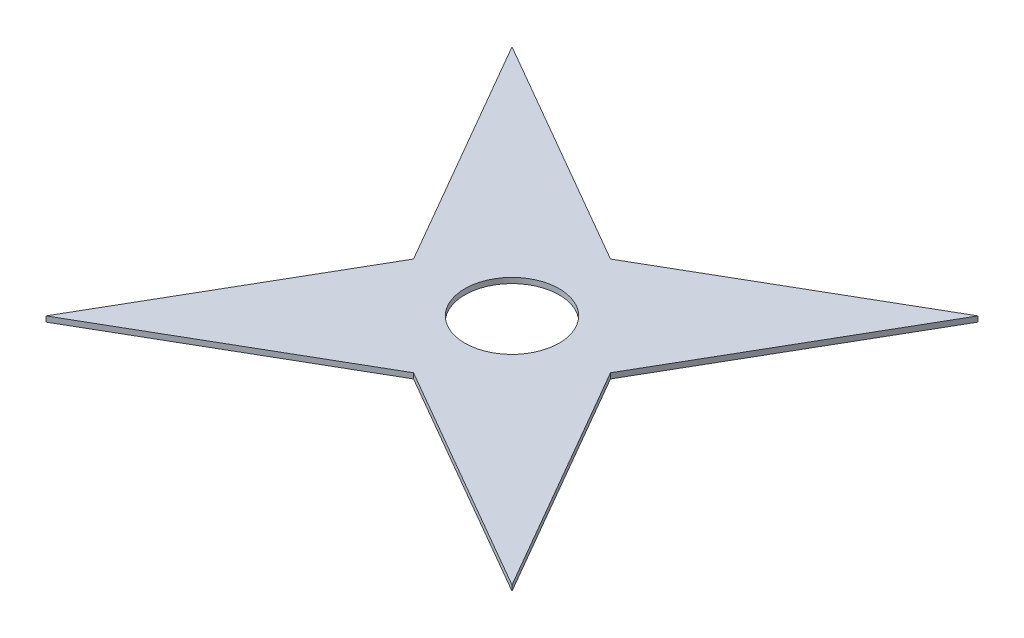
ISO-10303-21;
HEADER;
FILE_DESCRIPTION(('STEP AP214'),'2;1');
FILE_NAME('part.step','',(''),(''),'','','');
FILE_SCHEMA(('AUTOMOTIVE_DESIGN { 1 0 10303 214 1 1 1 1 }'));
ENDSEC;
DATA;
#1=APPLICATION_CONTEXT('core data for automotive mechanical design processes');
#2=APPLICATION_PROTOCOL_DEFINITION('international standard','automotive_design',2000,#1);
#3=PRODUCT_CONTEXT('',#1,'mechanical');
#4=PRODUCT('Part','Part','',(#3));
#5=PRODUCT_RELATED_PRODUCT_CATEGORY('part','',(#4));
#6=PRODUCT_DEFINITION_FORMATION('','',#4);
#7=PRODUCT_DEFINITION_CONTEXT('part definition',#1,'design');
#8=PRODUCT_DEFINITION('design','',#6,#7);
#9=PRODUCT_DEFINITION_SHAPE('','',#8);
#10=(LENGTH_UNIT() NAMED_UNIT(*) SI_UNIT(.MILLI.,.METRE.));
#11=(NAMED_UNIT(*) PLANE_ANGLE_UNIT() SI_UNIT($,.RADIAN.));
#12=(NAMED_UNIT(*) SI_UNIT($,.STERADIAN.) SOLID_ANGLE_UNIT());
#13=UNCERTAINTY_MEASURE_WITH_UNIT(LENGTH_MEASURE(1.E-05),#10,'distance_accuracy_value','');
#14=(GEOMETRIC_REPRESENTATION_CONTEXT(3) GLOBAL_UNCERTAINTY_ASSIGNED_CONTEXT((#13)) GLOBAL_UNIT_ASSIGNED_CONTEXT((#10,
#11,#12)) REPRESENTATION_CONTEXT('',''));
#15=CARTESIAN_POINT('',(0.,0.,0.));
#16=DIRECTION('',(0.,0.,1.));
#17=DIRECTION('',(1.,0.,0.));
#18=AXIS2_PLACEMENT_3D('',#15,#16,#17);
#19=CARTESIAN_POINT('',(0.,1.5,0.));
#20=DIRECTION('',(0.,1.,0.));
#21=DIRECTION('',(0.,0.,1.));
#22=AXIS2_PLACEMENT_3D('',#19,#20,#21);
#23=PLANE('',#22);
#24=DIRECTION('',(0.866025403784438,0.,-0.500000000000001));
#25=VECTOR('',#24,1.);
#26=CARTESIAN_POINT('',(0.,1.5,0.));
#27=LINE('',#26,#25);
#28=CARTESIAN_POINT('',(0.,1.5,0.));
#29=VERTEX_POINT('',#28);
#30=CARTESIAN_POINT('',(64.9519052838328,1.5,-37.5000000000001));
#31=VERTEX_POINT('',#30);
#32=EDGE_CURVE('E149',#29,#31,#27,.T.);
#33=ORIENTED_EDGE('',*,*,#32,.T.);
#34=DIRECTION('',(0.866025403784438,0.,0.500000000000001));
#35=VECTOR('',#34,1.);
#36=CARTESIAN_POINT('',(129.903810567666,1.5,0.));
#37=LINE('',#36,#35);
#38=CARTESIAN_POINT('',(129.903810567666,1.5,0.));
#39=VERTEX_POINT('',#38);
#40=EDGE_CURVE('E97',#31,#39,#37,.T.);
#41=ORIENTED_EDGE('',*,*,#40,.T.);
#42=DIRECTION('',(-0.500000000000001,0.,-0.866025403784438));
#43=VECTOR('',#42,1.);
#44=CARTESIAN_POINT('',(129.903810567666,1.5,0.));
#45=LINE('',#44,#43);
#46=CARTESIAN_POINT('',(92.4038105676656,1.5,-64.9519052838328));
#47=VERTEX_POINT('',#46);
#48=EDGE_CURVE('E164',#39,#47,#45,.T.);
#49=ORIENTED_EDGE('',*,*,#48,.T.);
#50=DIRECTION('',(0.5,0.,-0.866025403784438));
#51=VECTOR('',#50,1.);
#52=CARTESIAN_POINT('',(129.903810567666,1.5,-129.903810567666));
#53=LINE('',#52,#51);
#54=CARTESIAN_POINT('',(129.903810567666,1.5,-129.903810567666));
#55=VERTEX_POINT('',#54);
#56=EDGE_CURVE('E177',#47,#55,#53,.T.);
#57=ORIENTED_EDGE('',*,*,#56,.T.);
#58=DIRECTION('',(-0.866025403784438,0.,0.500000000000001));
#59=VECTOR('',#58,1.);
#60=CARTESIAN_POINT('',(129.903810567666,1.5,-129.903810567666));
#61=LINE('',#60,#59);
#62=CARTESIAN_POINT('',(64.9519052838328,1.5,-92.4038105676656));
#63=VERTEX_POINT('',#62);
#64=EDGE_CURVE('E116',#55,#63,#61,.T.);
#65=ORIENTED_EDGE('',*,*,#64,.T.);
#66=DIRECTION('',(-0.866025403784438,0.,-0.500000000000001));
#67=VECTOR('',#66,1.);
#68=CARTESIAN_POINT('',(0.,1.5,-129.903810567666));
#69=LINE('',#68,#67);
#70=CARTESIAN_POINT('',(0.,1.5,-129.903810567666));
#71=VERTEX_POINT('',#70);
#72=EDGE_CURVE('E110',#63,#71,#69,.T.);
#73=ORIENTED_EDGE('',*,*,#72,.T.);
#74=DIRECTION('',(0.500000000000001,0.,0.866025403784438));
#75=VECTOR('',#74,1.);
#76=CARTESIAN_POINT('',(0.,1.5,-129.903810567666));
#77=LINE('',#76,#75);
#78=CARTESIAN_POINT('',(37.5000000000001,1.5,-64.9519052838328));
#79=VERTEX_POINT('',#78);
#80=EDGE_CURVE('E114',#71,#79,#77,.T.);
#81=ORIENTED_EDGE('',*,*,#80,.T.);
#82=DIRECTION('',(-0.500000000000001,0.,0.866025403784438));
#83=VECTOR('',#82,1.);
#84=CARTESIAN_POINT('',(0.,1.5,0.));
#85=LINE('',#84,#83);
#86=EDGE_CURVE('E54',#79,#29,#85,.T.);
#87=ORIENTED_EDGE('',*,*,#86,.T.);
#88=EDGE_LOOP('',(#33,#41,#49,#57,#65,#73,#81,#87));
#89=FACE_BOUND('',#88,.T.);
#90=CARTESIAN_POINT('',(64.9519052838328,1.5,-64.9519052838328));
#91=DIRECTION('',(0.,1.,0.));
#92=DIRECTION('',(0.,0.,1.));
#93=AXIS2_PLACEMENT_3D('',#90,#91,#92);
#94=CIRCLE('',#93,13.155);
#95=CARTESIAN_POINT('',(64.9519052838328,1.5,-51.7969052838328));
#96=VERTEX_POINT('',#95);
#97=EDGE_CURVE('E138',#96,#96,#94,.T.);
#98=ORIENTED_EDGE('',*,*,#97,.F.);
#99=EDGE_LOOP('',(#98));
#100=FACE_BOUND('',#99,.T.);
#101=ADVANCED_FACE('F37',(#89,#100),#23,.T.);
#102=CARTESIAN_POINT('',(0.,0.,0.));
#103=DIRECTION('',(0.,1.,0.));
#104=DIRECTION('',(0.,0.,1.));
#105=AXIS2_PLACEMENT_3D('',#102,#103,#104);
#106=PLANE('',#105);
#107=DIRECTION('',(0.866025403784438,0.,-0.500000000000001));
#108=VECTOR('',#107,1.);
#109=CARTESIAN_POINT('',(0.,0.,0.));
#110=LINE('',#109,#108);
#111=CARTESIAN_POINT('',(0.,0.,0.));
#112=VERTEX_POINT('',#111);
#113=CARTESIAN_POINT('',(64.9519052838328,0.,-37.5000000000001));
#114=VERTEX_POINT('',#113);
#115=EDGE_CURVE('E134',#112,#114,#110,.T.);
#116=ORIENTED_EDGE('',*,*,#115,.F.);
#117=DIRECTION('',(-0.500000000000001,0.,0.866025403784438));
#118=VECTOR('',#117,1.);
#119=CARTESIAN_POINT('',(0.,0.,0.));
#120=LINE('',#119,#118);
#121=CARTESIAN_POINT('',(37.5000000000001,0.,-64.9519052838328));
#122=VERTEX_POINT('',#121);
#123=EDGE_CURVE('E89',#122,#112,#120,.T.);
#124=ORIENTED_EDGE('',*,*,#123,.F.);
#125=DIRECTION('',(0.500000000000001,0.,0.866025403784438));
#126=VECTOR('',#125,1.);
#127=CARTESIAN_POINT('',(0.,0.,-129.903810567666));
#128=LINE('',#127,#126);
#129=CARTESIAN_POINT('',(0.,0.,-129.903810567666));
#130=VERTEX_POINT('',#129);
#131=EDGE_CURVE('E83',#130,#122,#128,.T.);
#132=ORIENTED_EDGE('',*,*,#131,.F.);
#133=DIRECTION('',(-0.866025403784438,0.,-0.500000000000001));
#134=VECTOR('',#133,1.);
#135=CARTESIAN_POINT('',(0.,0.,-129.903810567666));
#136=LINE('',#135,#134);
#137=CARTESIAN_POINT('',(64.9519052838328,0.,-92.4038105676656));
#138=VERTEX_POINT('',#137);
#139=EDGE_CURVE('E124',#138,#130,#136,.T.);
#140=ORIENTED_EDGE('',*,*,#139,.F.);
#141=DIRECTION('',(-0.866025403784438,0.,0.500000000000001));
#142=VECTOR('',#141,1.);
#143=CARTESIAN_POINT('',(129.903810567666,0.,-129.903810567666));
#144=LINE('',#143,#142);
#145=CARTESIAN_POINT('',(129.903810567666,0.,-129.903810567666));
#146=VERTEX_POINT('',#145);
#147=EDGE_CURVE('E144',#146,#138,#144,.T.);
#148=ORIENTED_EDGE('',*,*,#147,.F.);
#149=DIRECTION('',(0.5,0.,-0.866025403784438));
#150=VECTOR('',#149,1.);
#151=CARTESIAN_POINT('',(129.903810567666,0.,-129.903810567666));
#152=LINE('',#151,#150);
#153=CARTESIAN_POINT('',(92.4038105676656,0.,-64.9519052838328));
#154=VERTEX_POINT('',#153);
#155=EDGE_CURVE('E142',#154,#146,#152,.T.);
#156=ORIENTED_EDGE('',*,*,#155,.F.);
#157=DIRECTION('',(-0.500000000000001,0.,-0.866025403784438));
#158=VECTOR('',#157,1.);
#159=CARTESIAN_POINT('',(129.903810567666,0.,0.));
#160=LINE('',#159,#158);
#161=CARTESIAN_POINT('',(129.903810567666,0.,0.));
#162=VERTEX_POINT('',#161);
#163=EDGE_CURVE('E140',#162,#154,#160,.T.);
#164=ORIENTED_EDGE('',*,*,#163,.F.);
#165=DIRECTION('',(0.866025403784438,0.,0.500000000000001));
#166=VECTOR('',#165,1.);
#167=CARTESIAN_POINT('',(129.903810567666,0.,0.));
#168=LINE('',#167,#166);
#169=EDGE_CURVE('E137',#114,#162,#168,.T.);
#170=ORIENTED_EDGE('',*,*,#169,.F.);
#171=EDGE_LOOP('',(#116,#124,#132,#140,#148,#156,#164,#170));
#172=FACE_BOUND('',#171,.T.);
#173=CARTESIAN_POINT('',(64.9519052838328,0.,-64.9519052838328));
#174=DIRECTION('',(0.,1.,0.));
#175=DIRECTION('',(0.,0.,1.));
#176=AXIS2_PLACEMENT_3D('',#173,#174,#175);
#177=CIRCLE('',#176,13.155);
#178=CARTESIAN_POINT('',(64.9519052838328,0.,-51.7969052838328));
#179=VERTEX_POINT('',#178);
#180=EDGE_CURVE('E183',#179,#179,#177,.T.);
#181=ORIENTED_EDGE('',*,*,#180,.T.);
#182=EDGE_LOOP('',(#181));
#183=FACE_BOUND('',#182,.T.);
#184=ADVANCED_FACE('F168',(#172,#183),#106,.F.);
#185=CARTESIAN_POINT('',(0.,1.5,0.));
#186=DIRECTION('',(-0.500000000000001,0.,-0.866025403784438));
#187=DIRECTION('',(-0.866025403784438,0.,0.500000000000001));
#188=AXIS2_PLACEMENT_3D('',#185,#186,#187);
#189=PLANE('',#188);
#190=ORIENTED_EDGE('',*,*,#115,.T.);
#191=DIRECTION('',(0.,-1.,0.));
#192=VECTOR('',#191,1.);
#193=CARTESIAN_POINT('',(64.9519052838328,1.5,-37.5000000000001));
#194=LINE('',#193,#192);
#195=EDGE_CURVE('E11',#31,#114,#194,.T.);
#196=ORIENTED_EDGE('',*,*,#195,.F.);
#197=ORIENTED_EDGE('',*,*,#32,.F.);
#198=DIRECTION('',(0.,-1.,0.));
#199=VECTOR('',#198,1.);
#200=CARTESIAN_POINT('',(0.,1.5,0.));
#201=LINE('',#200,#199);
#202=EDGE_CURVE('E130',#29,#112,#201,.T.);
#203=ORIENTED_EDGE('',*,*,#202,.T.);
#204=EDGE_LOOP('',(#190,#196,#197,#203));
#205=FACE_BOUND('',#204,.T.);
#206=ADVANCED_FACE('F39',(#205),#189,.F.);
#207=CARTESIAN_POINT('',(129.903810567666,1.5,0.));
#208=DIRECTION('',(0.500000000000001,0.,-0.866025403784438));
#209=DIRECTION('',(-0.866025403784438,0.,-0.500000000000001));
#210=AXIS2_PLACEMENT_3D('',#207,#208,#209);
#211=PLANE('',#210);
#212=ORIENTED_EDGE('',*,*,#169,.T.);
#213=DIRECTION('',(0.,-1.,0.));
#214=VECTOR('',#213,1.);
#215=CARTESIAN_POINT('',(129.903810567666,1.5,0.));
#216=LINE('',#215,#214);
#217=EDGE_CURVE('E46',#39,#162,#216,.T.);
#218=ORIENTED_EDGE('',*,*,#217,.F.);
#219=ORIENTED_EDGE('',*,*,#40,.F.);
#220=ORIENTED_EDGE('',*,*,#195,.T.);
#221=EDGE_LOOP('',(#212,#218,#219,#220));
#222=FACE_BOUND('',#221,.T.);
#223=ADVANCED_FACE('F211',(#222),#211,.F.);
#224=CARTESIAN_POINT('',(129.903810567666,1.5,0.));
#225=DIRECTION('',(-0.866025403784438,0.,0.500000000000001));
#226=DIRECTION('',(0.500000000000001,0.,0.866025403784438));
#227=AXIS2_PLACEMENT_3D('',#224,#225,#226);
#228=PLANE('',#227);
#229=ORIENTED_EDGE('',*,*,#163,.T.);
#230=DIRECTION('',(0.,-1.,0.));
#231=VECTOR('',#230,1.);
#232=CARTESIAN_POINT('',(92.4038105676656,1.5,-64.9519052838328));
#233=LINE('',#232,#231);
#234=EDGE_CURVE('E156',#47,#154,#233,.T.);
#235=ORIENTED_EDGE('',*,*,#234,.F.);
#236=ORIENTED_EDGE('',*,*,#48,.F.);
#237=ORIENTED_EDGE('',*,*,#217,.T.);
#238=EDGE_LOOP('',(#229,#235,#236,#237));
#239=FACE_BOUND('',#238,.T.);
#240=ADVANCED_FACE('F162',(#239),#228,.F.);
#241=CARTESIAN_POINT('',(129.903810567666,1.5,-129.903810567666));
#242=DIRECTION('',(-0.866025403784438,0.,-0.500000000000001));
#243=DIRECTION('',(-0.500000000000001,0.,0.866025403784438));
#244=AXIS2_PLACEMENT_3D('',#241,#242,#243);
#245=PLANE('',#244);
#246=ORIENTED_EDGE('',*,*,#155,.T.);
#247=DIRECTION('',(0.,-1.,0.));
#248=VECTOR('',#247,1.);
#249=CARTESIAN_POINT('',(129.903810567666,1.5,-129.903810567666));
#250=LINE('',#249,#248);
#251=EDGE_CURVE('E153',#55,#146,#250,.T.);
#252=ORIENTED_EDGE('',*,*,#251,.F.);
#253=ORIENTED_EDGE('',*,*,#56,.F.);
#254=ORIENTED_EDGE('',*,*,#234,.T.);
#255=EDGE_LOOP('',(#246,#252,#253,#254));
#256=FACE_BOUND('',#255,.T.);
#257=ADVANCED_FACE('F173',(#256),#245,.F.);
#258=CARTESIAN_POINT('',(129.903810567666,1.5,-129.903810567666));
#259=DIRECTION('',(0.500000000000001,0.,0.866025403784438));
#260=DIRECTION('',(0.866025403784438,0.,-0.500000000000001));
#261=AXIS2_PLACEMENT_3D('',#258,#259,#260);
#262=PLANE('',#261);
#263=ORIENTED_EDGE('',*,*,#147,.T.);
#264=DIRECTION('',(0.,-1.,0.));
#265=VECTOR('',#264,1.);
#266=CARTESIAN_POINT('',(64.9519052838328,1.5,-92.4038105676656));
#267=LINE('',#266,#265);
#268=EDGE_CURVE('E125',#63,#138,#267,.T.);
#269=ORIENTED_EDGE('',*,*,#268,.F.);
#270=ORIENTED_EDGE('',*,*,#64,.F.);
#271=ORIENTED_EDGE('',*,*,#251,.T.);
#272=EDGE_LOOP('',(#263,#269,#270,#271));
#273=FACE_BOUND('',#272,.T.);
#274=ADVANCED_FACE('F176',(#273),#262,.F.);
#275=CARTESIAN_POINT('',(0.,1.5,-129.903810567666));
#276=DIRECTION('',(-0.500000000000001,0.,0.866025403784438));
#277=DIRECTION('',(0.866025403784438,0.,0.500000000000001));
#278=AXIS2_PLACEMENT_3D('',#275,#276,#277);
#279=PLANE('',#278);
#280=ORIENTED_EDGE('',*,*,#139,.T.);
#281=DIRECTION('',(0.,-1.,0.));
#282=VECTOR('',#281,1.);
#283=CARTESIAN_POINT('',(0.,1.5,-129.903810567666));
#284=LINE('',#283,#282);
#285=EDGE_CURVE('E121',#71,#130,#284,.T.);
#286=ORIENTED_EDGE('',*,*,#285,.F.);
#287=ORIENTED_EDGE('',*,*,#72,.F.);
#288=ORIENTED_EDGE('',*,*,#268,.T.);
#289=EDGE_LOOP('',(#280,#286,#287,#288));
#290=FACE_BOUND('',#289,.T.);
#291=ADVANCED_FACE('F122',(#290),#279,.F.);
#292=CARTESIAN_POINT('',(0.,1.5,-129.903810567666));
#293=DIRECTION('',(0.866025403784438,0.,-0.500000000000001));
#294=DIRECTION('',(-0.500000000000001,0.,-0.866025403784438));
#295=AXIS2_PLACEMENT_3D('',#292,#293,#294);
#296=PLANE('',#295);
#297=ORIENTED_EDGE('',*,*,#131,.T.);
#298=DIRECTION('',(0.,-1.,0.));
#299=VECTOR('',#298,1.);
#300=CARTESIAN_POINT('',(37.5000000000001,1.5,-64.9519052838328));
#301=LINE('',#300,#299);
#302=EDGE_CURVE('E126',#79,#122,#301,.T.);
#303=ORIENTED_EDGE('',*,*,#302,.F.);
#304=ORIENTED_EDGE('',*,*,#80,.F.);
#305=ORIENTED_EDGE('',*,*,#285,.T.);
#306=EDGE_LOOP('',(#297,#303,#304,#305));
#307=FACE_BOUND('',#306,.T.);
#308=ADVANCED_FACE('F128',(#307),#296,.F.);
#309=CARTESIAN_POINT('',(0.,1.5,0.));
#310=DIRECTION('',(0.866025403784438,0.,0.500000000000001));
#311=DIRECTION('',(0.500000000000001,0.,-0.866025403784438));
#312=AXIS2_PLACEMENT_3D('',#309,#310,#311);
#313=PLANE('',#312);
#314=ORIENTED_EDGE('',*,*,#123,.T.);
#315=ORIENTED_EDGE('',*,*,#202,.F.);
#316=ORIENTED_EDGE('',*,*,#86,.F.);
#317=ORIENTED_EDGE('',*,*,#302,.T.);
#318=EDGE_LOOP('',(#314,#315,#316,#317));
#319=FACE_BOUND('',#318,.T.);
#320=ADVANCED_FACE('F199',(#319),#313,.F.);
#321=CARTESIAN_POINT('',(64.9519052838328,1.5,-64.9519052838328));
#322=DIRECTION('',(0.,-1.,0.));
#323=DIRECTION('',(0.,0.,-1.));
#324=AXIS2_PLACEMENT_3D('',#321,#322,#323);
#325=CYLINDRICAL_SURFACE('',#324,13.155);
#326=ORIENTED_EDGE('',*,*,#97,.T.);
#327=EDGE_LOOP('',(#326));
#328=FACE_BOUND('',#327,.T.);
#329=ORIENTED_EDGE('',*,*,#180,.F.);
#330=EDGE_LOOP('',(#329));
#331=FACE_BOUND('',#330,.T.);
#332=ADVANCED_FACE('F189',(#328,#331),#325,.F.);
#333=CLOSED_SHELL('',(#101,#184,#206,#223,#240,#257,#274,#291,#308,#320,#332));
#334=MANIFOLD_SOLID_BREP('B2',#333);
#335=ADVANCED_BREP_SHAPE_REPRESENTATION('',(#18,#334),#14);
#336=SHAPE_DEFINITION_REPRESENTATION(#9,#335);
ENDSEC;
END-ISO-10303-21;
